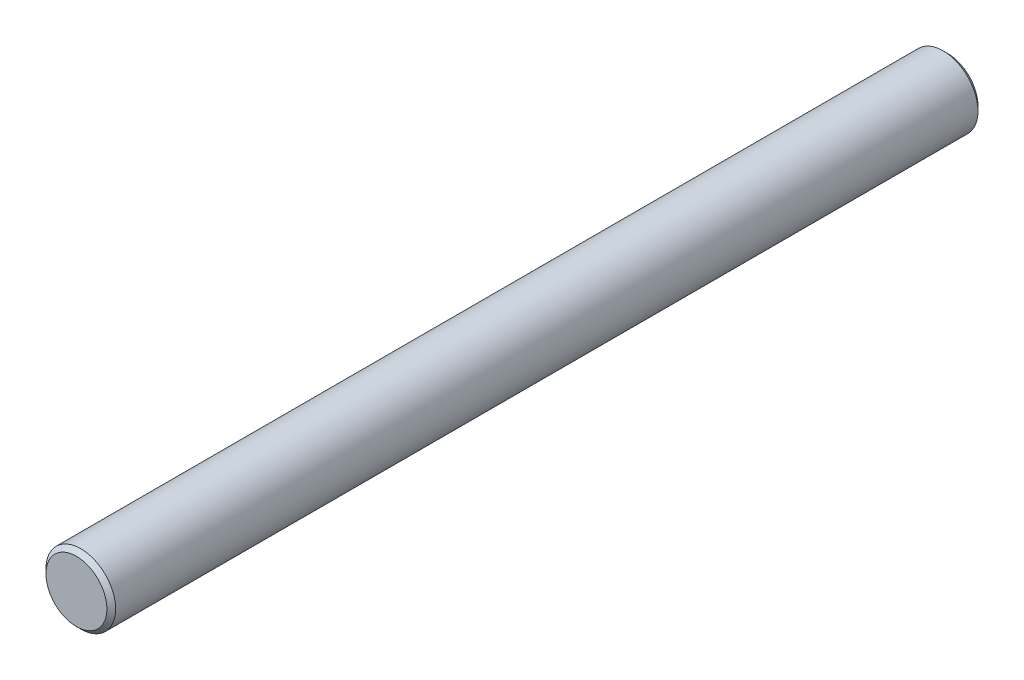
ISO-10303-21;
HEADER;
FILE_DESCRIPTION(('STEP AP214'),'2;1');
FILE_NAME('part.step','',(''),(''),'','','');
FILE_SCHEMA(('AUTOMOTIVE_DESIGN { 1 0 10303 214 1 1 1 1 }'));
ENDSEC;
DATA;
#1=APPLICATION_CONTEXT('core data for automotive mechanical design processes');
#2=APPLICATION_PROTOCOL_DEFINITION('international standard','automotive_design',2000,#1);
#3=PRODUCT_CONTEXT('',#1,'mechanical');
#4=PRODUCT('Part','Part','',(#3));
#5=PRODUCT_RELATED_PRODUCT_CATEGORY('part','',(#4));
#6=PRODUCT_DEFINITION_FORMATION('','',#4);
#7=PRODUCT_DEFINITION_CONTEXT('part definition',#1,'design');
#8=PRODUCT_DEFINITION('design','',#6,#7);
#9=PRODUCT_DEFINITION_SHAPE('','',#8);
#10=(LENGTH_UNIT() NAMED_UNIT(*) SI_UNIT(.MILLI.,.METRE.));
#11=(NAMED_UNIT(*) PLANE_ANGLE_UNIT() SI_UNIT($,.RADIAN.));
#12=(NAMED_UNIT(*) SI_UNIT($,.STERADIAN.) SOLID_ANGLE_UNIT());
#13=UNCERTAINTY_MEASURE_WITH_UNIT(LENGTH_MEASURE(1.E-05),#10,'distance_accuracy_value','');
#14=(GEOMETRIC_REPRESENTATION_CONTEXT(3) GLOBAL_UNCERTAINTY_ASSIGNED_CONTEXT((#13)) GLOBAL_UNIT_ASSIGNED_CONTEXT((#10,
#11,#12)) REPRESENTATION_CONTEXT('',''));
#15=CARTESIAN_POINT('',(0.,0.,0.));
#16=DIRECTION('',(0.,0.,1.));
#17=DIRECTION('',(1.,0.,0.));
#18=AXIS2_PLACEMENT_3D('',#15,#16,#17);
#19=CARTESIAN_POINT('',(0.,0.,100.));
#20=DIRECTION('',(0.,0.,-1.));
#21=DIRECTION('',(-1.,0.,0.));
#22=AXIS2_PLACEMENT_3D('',#19,#20,#21);
#23=CYLINDRICAL_SURFACE('',#22,4.);
#24=CARTESIAN_POINT('',(0.,0.,99.5));
#25=DIRECTION('',(0.,0.,1.));
#26=DIRECTION('',(1.,0.,0.));
#27=AXIS2_PLACEMENT_3D('',#24,#25,#26);
#28=CIRCLE('',#27,4.);
#29=CARTESIAN_POINT('',(4.,0.,99.5));
#30=VERTEX_POINT('',#29);
#31=EDGE_CURVE('E38',#30,#30,#28,.F.);
#32=ORIENTED_EDGE('',*,*,#31,.T.);
#33=EDGE_LOOP('',(#32));
#34=FACE_BOUND('',#33,.T.);
#35=CARTESIAN_POINT('',(0.,0.,0.500000000000014));
#36=DIRECTION('',(0.,0.,1.));
#37=DIRECTION('',(1.,0.,0.));
#38=AXIS2_PLACEMENT_3D('',#35,#36,#37);
#39=CIRCLE('',#38,4.);
#40=CARTESIAN_POINT('',(4.,0.,0.500000000000014));
#41=VERTEX_POINT('',#40);
#42=EDGE_CURVE('E42',#41,#41,#39,.T.);
#43=ORIENTED_EDGE('',*,*,#42,.T.);
#44=EDGE_LOOP('',(#43));
#45=FACE_BOUND('',#44,.T.);
#46=ADVANCED_FACE('F31',(#34,#45),#23,.T.);
#47=CARTESIAN_POINT('',(0.,0.,100.));
#48=DIRECTION('',(0.,0.,1.));
#49=DIRECTION('',(1.,0.,0.));
#50=AXIS2_PLACEMENT_3D('',#47,#48,#49);
#51=PLANE('',#50);
#52=CARTESIAN_POINT('',(0.,0.,100.));
#53=DIRECTION('',(0.,0.,1.));
#54=DIRECTION('',(1.,0.,0.));
#55=AXIS2_PLACEMENT_3D('',#52,#53,#54);
#56=CIRCLE('',#55,3.50000000000002);
#57=CARTESIAN_POINT('',(3.50000000000002,0.,100.));
#58=VERTEX_POINT('',#57);
#59=EDGE_CURVE('E46',#58,#58,#56,.T.);
#60=ORIENTED_EDGE('',*,*,#59,.T.);
#61=EDGE_LOOP('',(#60));
#62=FACE_BOUND('',#61,.T.);
#63=ADVANCED_FACE('F52',(#62),#51,.T.);
#64=CARTESIAN_POINT('',(0.,0.,0.));
#65=DIRECTION('',(0.,0.,1.));
#66=DIRECTION('',(1.,0.,0.));
#67=AXIS2_PLACEMENT_3D('',#64,#65,#66);
#68=PLANE('',#67);
#69=CARTESIAN_POINT('',(0.,0.,0.));
#70=DIRECTION('',(0.,0.,1.));
#71=DIRECTION('',(1.,0.,0.));
#72=AXIS2_PLACEMENT_3D('',#69,#70,#71);
#73=CIRCLE('',#72,3.49999999999999);
#74=CARTESIAN_POINT('',(3.49999999999999,0.,0.));
#75=VERTEX_POINT('',#74);
#76=EDGE_CURVE('E10',#75,#75,#73,.F.);
#77=ORIENTED_EDGE('',*,*,#76,.T.);
#78=EDGE_LOOP('',(#77));
#79=FACE_BOUND('',#78,.T.);
#80=ADVANCED_FACE('F56',(#79),#68,.F.);
#81=CARTESIAN_POINT('',(0.,0.,100.));
#82=DIRECTION('',(0.,0.,-1.));
#83=DIRECTION('',(-1.,0.,0.));
#84=AXIS2_PLACEMENT_3D('',#81,#82,#83);
#85=CONICAL_SURFACE('',#84,3.50000000000002,0.785398163397431);
#86=ORIENTED_EDGE('',*,*,#31,.F.);
#87=EDGE_LOOP('',(#86));
#88=FACE_BOUND('',#87,.T.);
#89=ORIENTED_EDGE('',*,*,#59,.F.);
#90=EDGE_LOOP('',(#89));
#91=FACE_BOUND('',#90,.T.);
#92=ADVANCED_FACE('F54',(#88,#91),#85,.T.);
#93=CARTESIAN_POINT('',(0.,0.,0.500000000000014));
#94=DIRECTION('',(0.,0.,1.));
#95=DIRECTION('',(1.,0.,0.));
#96=AXIS2_PLACEMENT_3D('',#93,#94,#95);
#97=CONICAL_SURFACE('',#96,4.,0.785398163397445);
#98=ORIENTED_EDGE('',*,*,#76,.F.);
#99=EDGE_LOOP('',(#98));
#100=FACE_BOUND('',#99,.T.);
#101=ORIENTED_EDGE('',*,*,#42,.F.);
#102=EDGE_LOOP('',(#101));
#103=FACE_BOUND('',#102,.T.);
#104=ADVANCED_FACE('F33',(#100,#103),#97,.T.);
#105=CLOSED_SHELL('',(#46,#63,#80,#92,#104));
#106=MANIFOLD_SOLID_BREP('B2',#105);
#107=ADVANCED_BREP_SHAPE_REPRESENTATION('',(#18,#106),#14);
#108=SHAPE_DEFINITION_REPRESENTATION(#9,#107);
ENDSEC;
END-ISO-10303-21;
